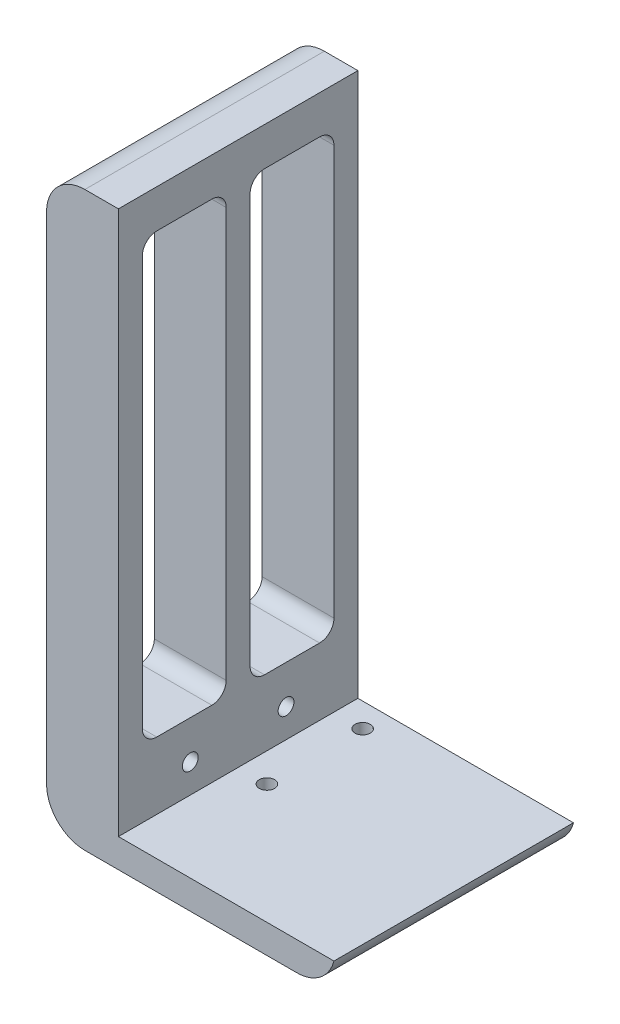
ISO-10303-21;
HEADER;
FILE_DESCRIPTION(('STEP AP214'),'2;1');
FILE_NAME('part.step','',(''),(''),'','','');
FILE_SCHEMA(('AUTOMOTIVE_DESIGN { 1 0 10303 214 1 1 1 1 }'));
ENDSEC;
DATA;
#1=APPLICATION_CONTEXT('core data for automotive mechanical design processes');
#2=APPLICATION_PROTOCOL_DEFINITION('international standard','automotive_design',2000,#1);
#3=PRODUCT_CONTEXT('',#1,'mechanical');
#4=PRODUCT('Part','Part','',(#3));
#5=PRODUCT_RELATED_PRODUCT_CATEGORY('part','',(#4));
#6=PRODUCT_DEFINITION_FORMATION('','',#4);
#7=PRODUCT_DEFINITION_CONTEXT('part definition',#1,'design');
#8=PRODUCT_DEFINITION('design','',#6,#7);
#9=PRODUCT_DEFINITION_SHAPE('','',#8);
#10=(LENGTH_UNIT() NAMED_UNIT(*) SI_UNIT(.MILLI.,.METRE.));
#11=(NAMED_UNIT(*) PLANE_ANGLE_UNIT() SI_UNIT($,.RADIAN.));
#12=(NAMED_UNIT(*) SI_UNIT($,.STERADIAN.) SOLID_ANGLE_UNIT());
#13=UNCERTAINTY_MEASURE_WITH_UNIT(LENGTH_MEASURE(1.E-05),#10,'distance_accuracy_value','');
#14=(GEOMETRIC_REPRESENTATION_CONTEXT(3) GLOBAL_UNCERTAINTY_ASSIGNED_CONTEXT((#13)) GLOBAL_UNIT_ASSIGNED_CONTEXT((#10,
#11,#12)) REPRESENTATION_CONTEXT('',''));
#15=CARTESIAN_POINT('',(0.,0.,0.));
#16=DIRECTION('',(0.,0.,1.));
#17=DIRECTION('',(1.,0.,0.));
#18=AXIS2_PLACEMENT_3D('',#15,#16,#17);
#19=CARTESIAN_POINT('',(0.,0.,25.));
#20=DIRECTION('',(1.,0.,0.));
#21=DIRECTION('',(0.,0.,-1.));
#22=AXIS2_PLACEMENT_3D('',#19,#20,#21);
#23=PLANE('',#22);
#24=CARTESIAN_POINT('',(0.,12.,10.));
#25=DIRECTION('',(-1.,0.,0.));
#26=DIRECTION('',(0.,0.,1.));
#27=AXIS2_PLACEMENT_3D('',#24,#25,#26);
#28=CIRCLE('',#27,1.65);
#29=CARTESIAN_POINT('',(0.,12.,11.65));
#30=VERTEX_POINT('',#29);
#31=EDGE_CURVE('E269',#30,#30,#28,.T.);
#32=ORIENTED_EDGE('',*,*,#31,.F.);
#33=EDGE_LOOP('',(#32));
#34=FACE_BOUND('',#33,.T.);
#35=CARTESIAN_POINT('',(0.,12.,-10.));
#36=DIRECTION('',(-1.,0.,0.));
#37=DIRECTION('',(0.,0.,1.));
#38=AXIS2_PLACEMENT_3D('',#35,#36,#37);
#39=CIRCLE('',#38,1.65);
#40=CARTESIAN_POINT('',(0.,12.,-8.35));
#41=VERTEX_POINT('',#40);
#42=EDGE_CURVE('E259',#41,#41,#39,.T.);
#43=ORIENTED_EDGE('',*,*,#42,.F.);
#44=EDGE_LOOP('',(#43));
#45=FACE_BOUND('',#44,.T.);
#46=DIRECTION('',(0.,-1.,0.));
#47=VECTOR('',#46,1.);
#48=CARTESIAN_POINT('',(0.,20.,2.5));
#49=LINE('',#48,#47);
#50=CARTESIAN_POINT('',(0.,108.5,2.5));
#51=VERTEX_POINT('',#50);
#52=CARTESIAN_POINT('',(0.,23.,2.5));
#53=VERTEX_POINT('',#52);
#54=EDGE_CURVE('E237',#51,#53,#49,.T.);
#55=ORIENTED_EDGE('',*,*,#54,.F.);
#56=CARTESIAN_POINT('',(0.,108.5,5.5));
#57=DIRECTION('',(1.,0.,0.));
#58=DIRECTION('',(0.,0.,-1.));
#59=AXIS2_PLACEMENT_3D('',#56,#57,#58);
#60=CIRCLE('',#59,3.);
#61=CARTESIAN_POINT('',(0.,111.5,5.50000000000001));
#62=VERTEX_POINT('',#61);
#63=EDGE_CURVE('E189',#51,#62,#60,.T.);
#64=ORIENTED_EDGE('',*,*,#63,.T.);
#65=DIRECTION('',(0.,0.,-1.));
#66=VECTOR('',#65,1.);
#67=CARTESIAN_POINT('',(0.,111.5,25.));
#68=LINE('',#67,#66);
#69=CARTESIAN_POINT('',(0.,111.5,-5.5));
#70=VERTEX_POINT('',#69);
#71=EDGE_CURVE('E57',#62,#70,#68,.T.);
#72=ORIENTED_EDGE('',*,*,#71,.T.);
#73=CARTESIAN_POINT('',(0.,108.5,-5.5));
#74=DIRECTION('',(1.,0.,0.));
#75=DIRECTION('',(0.,0.,-1.));
#76=AXIS2_PLACEMENT_3D('',#73,#74,#75);
#77=CIRCLE('',#76,3.);
#78=CARTESIAN_POINT('',(0.,108.5,-2.5));
#79=VERTEX_POINT('',#78);
#80=EDGE_CURVE('E173',#70,#79,#77,.T.);
#81=ORIENTED_EDGE('',*,*,#80,.T.);
#82=DIRECTION('',(0.,1.,0.));
#83=VECTOR('',#82,1.);
#84=CARTESIAN_POINT('',(0.,20.,-2.5));
#85=LINE('',#84,#83);
#86=CARTESIAN_POINT('',(0.,23.,-2.5));
#87=VERTEX_POINT('',#86);
#88=EDGE_CURVE('E245',#87,#79,#85,.T.);
#89=ORIENTED_EDGE('',*,*,#88,.F.);
#90=CARTESIAN_POINT('',(0.,23.,-5.5));
#91=DIRECTION('',(1.,0.,0.));
#92=DIRECTION('',(0.,0.,-1.));
#93=AXIS2_PLACEMENT_3D('',#90,#91,#92);
#94=CIRCLE('',#93,3.);
#95=CARTESIAN_POINT('',(0.,20.,-5.5));
#96=VERTEX_POINT('',#95);
#97=EDGE_CURVE('E163',#87,#96,#94,.T.);
#98=ORIENTED_EDGE('',*,*,#97,.T.);
#99=DIRECTION('',(0.,0.,1.));
#100=VECTOR('',#99,1.);
#101=CARTESIAN_POINT('',(0.,20.,-20.));
#102=LINE('',#101,#100);
#103=CARTESIAN_POINT('',(0.,20.,-17.));
#104=VERTEX_POINT('',#103);
#105=EDGE_CURVE('E207',#104,#96,#102,.T.);
#106=ORIENTED_EDGE('',*,*,#105,.F.);
#107=CARTESIAN_POINT('',(0.,23.,-17.));
#108=DIRECTION('',(1.,0.,0.));
#109=DIRECTION('',(0.,0.,-1.));
#110=AXIS2_PLACEMENT_3D('',#107,#108,#109);
#111=CIRCLE('',#110,3.);
#112=CARTESIAN_POINT('',(0.,23.,-20.));
#113=VERTEX_POINT('',#112);
#114=EDGE_CURVE('E47',#104,#113,#111,.T.);
#115=ORIENTED_EDGE('',*,*,#114,.T.);
#116=DIRECTION('',(0.,-1.,0.));
#117=VECTOR('',#116,1.);
#118=CARTESIAN_POINT('',(0.,111.5,-20.));
#119=LINE('',#118,#117);
#120=CARTESIAN_POINT('',(0.,108.5,-20.));
#121=VERTEX_POINT('',#120);
#122=EDGE_CURVE('E201',#121,#113,#119,.T.);
#123=ORIENTED_EDGE('',*,*,#122,.F.);
#124=CARTESIAN_POINT('',(0.,108.5,-17.));
#125=DIRECTION('',(1.,0.,0.));
#126=DIRECTION('',(0.,0.,-1.));
#127=AXIS2_PLACEMENT_3D('',#124,#125,#126);
#128=CIRCLE('',#127,3.);
#129=CARTESIAN_POINT('',(0.,111.5,-17.));
#130=VERTEX_POINT('',#129);
#131=EDGE_CURVE('E177',#121,#130,#128,.T.);
#132=ORIENTED_EDGE('',*,*,#131,.T.);
#133=CARTESIAN_POINT('',(0.,111.5,-25.));
#134=VERTEX_POINT('',#133);
#135=EDGE_CURVE('E62',#130,#134,#68,.T.);
#136=ORIENTED_EDGE('',*,*,#135,.T.);
#137=DIRECTION('',(0.,-1.,0.));
#138=VECTOR('',#137,1.);
#139=CARTESIAN_POINT('',(0.,0.,-25.));
#140=LINE('',#139,#138);
#141=CARTESIAN_POINT('',(0.,8.,-25.));
#142=VERTEX_POINT('',#141);
#143=EDGE_CURVE('E284',#134,#142,#140,.T.);
#144=ORIENTED_EDGE('',*,*,#143,.T.);
#145=DIRECTION('',(0.,0.,-1.));
#146=VECTOR('',#145,1.);
#147=CARTESIAN_POINT('',(0.,8.,25.));
#148=LINE('',#147,#146);
#149=CARTESIAN_POINT('',(0.,8.,25.));
#150=VERTEX_POINT('',#149);
#151=EDGE_CURVE('E316',#142,#150,#148,.F.);
#152=ORIENTED_EDGE('',*,*,#151,.T.);
#153=DIRECTION('',(0.,-1.,0.));
#154=VECTOR('',#153,1.);
#155=CARTESIAN_POINT('',(0.,0.,25.));
#156=LINE('',#155,#154);
#157=CARTESIAN_POINT('',(0.,111.5,25.));
#158=VERTEX_POINT('',#157);
#159=EDGE_CURVE('E295',#158,#150,#156,.T.);
#160=ORIENTED_EDGE('',*,*,#159,.F.);
#161=CARTESIAN_POINT('',(0.,111.5,17.));
#162=VERTEX_POINT('',#161);
#163=EDGE_CURVE('E76',#158,#162,#68,.T.);
#164=ORIENTED_EDGE('',*,*,#163,.T.);
#165=CARTESIAN_POINT('',(0.,108.5,17.));
#166=DIRECTION('',(1.,0.,0.));
#167=DIRECTION('',(0.,0.,-1.));
#168=AXIS2_PLACEMENT_3D('',#165,#166,#167);
#169=CIRCLE('',#168,3.);
#170=CARTESIAN_POINT('',(0.,108.5,20.));
#171=VERTEX_POINT('',#170);
#172=EDGE_CURVE('E183',#162,#171,#169,.T.);
#173=ORIENTED_EDGE('',*,*,#172,.T.);
#174=DIRECTION('',(0.,1.,0.));
#175=VECTOR('',#174,1.);
#176=CARTESIAN_POINT('',(0.,111.5,20.));
#177=LINE('',#176,#175);
#178=CARTESIAN_POINT('',(0.,23.,20.));
#179=VERTEX_POINT('',#178);
#180=EDGE_CURVE('E242',#179,#171,#177,.T.);
#181=ORIENTED_EDGE('',*,*,#180,.F.);
#182=CARTESIAN_POINT('',(0.,23.,17.));
#183=DIRECTION('',(1.,0.,0.));
#184=DIRECTION('',(0.,0.,-1.));
#185=AXIS2_PLACEMENT_3D('',#182,#183,#184);
#186=CIRCLE('',#185,3.);
#187=CARTESIAN_POINT('',(0.,20.,17.));
#188=VERTEX_POINT('',#187);
#189=EDGE_CURVE('E192',#179,#188,#186,.T.);
#190=ORIENTED_EDGE('',*,*,#189,.T.);
#191=DIRECTION('',(0.,0.,1.));
#192=VECTOR('',#191,1.);
#193=CARTESIAN_POINT('',(0.,20.,20.));
#194=LINE('',#193,#192);
#195=CARTESIAN_POINT('',(0.,20.,5.49999999999999));
#196=VERTEX_POINT('',#195);
#197=EDGE_CURVE('E239',#196,#188,#194,.T.);
#198=ORIENTED_EDGE('',*,*,#197,.F.);
#199=CARTESIAN_POINT('',(0.,23.,5.5));
#200=DIRECTION('',(1.,0.,0.));
#201=DIRECTION('',(0.,0.,-1.));
#202=AXIS2_PLACEMENT_3D('',#199,#200,#201);
#203=CIRCLE('',#202,3.);
#204=EDGE_CURVE('E143',#196,#53,#203,.T.);
#205=ORIENTED_EDGE('',*,*,#204,.T.);
#206=EDGE_LOOP('',(#55,#64,#72,#81,#89,#98,#106,#115,#123,#132,#136,#144,#152,#160,#164,#173,
#181,#190,#198,#205));
#207=FACE_BOUND('',#206,.T.);
#208=ADVANCED_FACE('F41',(#34,#45,#207),#23,.F.);
#209=CARTESIAN_POINT('',(60.,0.,25.));
#210=DIRECTION('',(0.,1.,0.));
#211=DIRECTION('',(-1.,0.,0.));
#212=AXIS2_PLACEMENT_3D('',#209,#210,#211);
#213=PLANE('',#212);
#214=CARTESIAN_POINT('',(21.0000000000001,0.,0.));
#215=DIRECTION('',(0.,1.,0.));
#216=DIRECTION('',(0.,0.,1.));
#217=AXIS2_PLACEMENT_3D('',#214,#215,#216);
#218=CIRCLE('',#217,1.6);
#219=CARTESIAN_POINT('',(21.0000000000001,0.,1.59999999999995));
#220=VERTEX_POINT('',#219);
#221=EDGE_CURVE('E260',#220,#220,#218,.T.);
#222=ORIENTED_EDGE('',*,*,#221,.T.);
#223=EDGE_LOOP('',(#222));
#224=FACE_BOUND('',#223,.T.);
#225=CARTESIAN_POINT('',(21.0000000000001,0.,-20.0000000000001));
#226=DIRECTION('',(0.,1.,0.));
#227=DIRECTION('',(0.,0.,1.));
#228=AXIS2_PLACEMENT_3D('',#225,#226,#227);
#229=CIRCLE('',#228,1.6);
#230=CARTESIAN_POINT('',(21.0000000000001,0.,-18.4000000000001));
#231=VERTEX_POINT('',#230);
#232=EDGE_CURVE('E256',#231,#231,#229,.T.);
#233=ORIENTED_EDGE('',*,*,#232,.T.);
#234=EDGE_LOOP('',(#233));
#235=FACE_BOUND('',#234,.T.);
#236=DIRECTION('',(1.,0.,0.));
#237=VECTOR('',#236,1.);
#238=CARTESIAN_POINT('',(60.,0.,-25.));
#239=LINE('',#238,#237);
#240=CARTESIAN_POINT('',(8.,0.,-25.));
#241=VERTEX_POINT('',#240);
#242=CARTESIAN_POINT('',(52.2540333075852,0.,-25.));
#243=VERTEX_POINT('',#242);
#244=EDGE_CURVE('E279',#241,#243,#239,.T.);
#245=ORIENTED_EDGE('',*,*,#244,.T.);
#246=DIRECTION('',(0.,0.,1.));
#247=VECTOR('',#246,1.);
#248=CARTESIAN_POINT('',(52.2540333075852,0.,25.));
#249=LINE('',#248,#247);
#250=CARTESIAN_POINT('',(52.2540333075852,0.,25.));
#251=VERTEX_POINT('',#250);
#252=EDGE_CURVE('E350',#243,#251,#249,.T.);
#253=ORIENTED_EDGE('',*,*,#252,.T.);
#254=DIRECTION('',(1.,0.,0.));
#255=VECTOR('',#254,1.);
#256=CARTESIAN_POINT('',(60.,0.,25.));
#257=LINE('',#256,#255);
#258=CARTESIAN_POINT('',(8.,0.,25.));
#259=VERTEX_POINT('',#258);
#260=EDGE_CURVE('E281',#259,#251,#257,.T.);
#261=ORIENTED_EDGE('',*,*,#260,.F.);
#262=DIRECTION('',(0.,0.,-1.));
#263=VECTOR('',#262,1.);
#264=CARTESIAN_POINT('',(8.,0.,25.));
#265=LINE('',#264,#263);
#266=EDGE_CURVE('E343',#259,#241,#265,.T.);
#267=ORIENTED_EDGE('',*,*,#266,.T.);
#268=EDGE_LOOP('',(#245,#253,#261,#267));
#269=FACE_BOUND('',#268,.T.);
#270=ADVANCED_FACE('F409',(#224,#235,#269),#213,.F.);
#271=CARTESIAN_POINT('',(15.,6.,25.));
#272=DIRECTION('',(0.,-1.,0.));
#273=DIRECTION('',(0.,0.,-1.));
#274=AXIS2_PLACEMENT_3D('',#271,#272,#273);
#275=PLANE('',#274);
#276=CARTESIAN_POINT('',(21.0000000000001,6.,0.));
#277=DIRECTION('',(0.,1.,0.));
#278=DIRECTION('',(0.,0.,1.));
#279=AXIS2_PLACEMENT_3D('',#276,#277,#278);
#280=CIRCLE('',#279,1.6);
#281=CARTESIAN_POINT('',(21.0000000000001,6.,1.59999999999995));
#282=VERTEX_POINT('',#281);
#283=EDGE_CURVE('E261',#282,#282,#280,.T.);
#284=ORIENTED_EDGE('',*,*,#283,.F.);
#285=EDGE_LOOP('',(#284));
#286=FACE_BOUND('',#285,.T.);
#287=CARTESIAN_POINT('',(21.0000000000001,6.,-20.0000000000001));
#288=DIRECTION('',(0.,1.,0.));
#289=DIRECTION('',(0.,0.,1.));
#290=AXIS2_PLACEMENT_3D('',#287,#288,#289);
#291=CIRCLE('',#290,1.6);
#292=CARTESIAN_POINT('',(21.0000000000001,6.,-18.4000000000001));
#293=VERTEX_POINT('',#292);
#294=EDGE_CURVE('E262',#293,#293,#291,.T.);
#295=ORIENTED_EDGE('',*,*,#294,.F.);
#296=EDGE_LOOP('',(#295));
#297=FACE_BOUND('',#296,.T.);
#298=DIRECTION('',(-1.,0.,0.));
#299=VECTOR('',#298,1.);
#300=CARTESIAN_POINT('',(15.,6.,-25.));
#301=LINE('',#300,#299);
#302=CARTESIAN_POINT('',(60.,6.,-25.));
#303=VERTEX_POINT('',#302);
#304=CARTESIAN_POINT('',(15.,6.,-25.));
#305=VERTEX_POINT('',#304);
#306=EDGE_CURVE('E297',#303,#305,#301,.T.);
#307=ORIENTED_EDGE('',*,*,#306,.T.);
#308=DIRECTION('',(0.,0.,-1.));
#309=VECTOR('',#308,1.);
#310=CARTESIAN_POINT('',(15.,6.,25.));
#311=LINE('',#310,#309);
#312=CARTESIAN_POINT('',(15.,6.,25.));
#313=VERTEX_POINT('',#312);
#314=EDGE_CURVE('E312',#313,#305,#311,.T.);
#315=ORIENTED_EDGE('',*,*,#314,.F.);
#316=DIRECTION('',(-1.,0.,0.));
#317=VECTOR('',#316,1.);
#318=CARTESIAN_POINT('',(15.,6.,25.));
#319=LINE('',#318,#317);
#320=CARTESIAN_POINT('',(60.,6.,25.));
#321=VERTEX_POINT('',#320);
#322=EDGE_CURVE('E282',#321,#313,#319,.T.);
#323=ORIENTED_EDGE('',*,*,#322,.F.);
#324=DIRECTION('',(0.,0.,-1.));
#325=VECTOR('',#324,1.);
#326=CARTESIAN_POINT('',(60.,6.,25.));
#327=LINE('',#326,#325);
#328=EDGE_CURVE('E317',#321,#303,#327,.T.);
#329=ORIENTED_EDGE('',*,*,#328,.T.);
#330=EDGE_LOOP('',(#307,#315,#323,#329));
#331=FACE_BOUND('',#330,.T.);
#332=ADVANCED_FACE('F435',(#286,#297,#331),#275,.F.);
#333=CARTESIAN_POINT('',(15.,119.5,25.));
#334=DIRECTION('',(-1.,0.,0.));
#335=DIRECTION('',(0.,-1.,0.));
#336=AXIS2_PLACEMENT_3D('',#333,#334,#335);
#337=PLANE('',#336);
#338=DIRECTION('',(0.,0.,-1.));
#339=VECTOR('',#338,1.);
#340=CARTESIAN_POINT('',(15.,111.5,25.));
#341=LINE('',#340,#339);
#342=CARTESIAN_POINT('',(15.,111.5,-5.5));
#343=VERTEX_POINT('',#342);
#344=CARTESIAN_POINT('',(15.,111.5,-17.));
#345=VERTEX_POINT('',#344);
#346=EDGE_CURVE('E351',#343,#345,#341,.T.);
#347=ORIENTED_EDGE('',*,*,#346,.T.);
#348=CARTESIAN_POINT('',(15.,108.5,-17.));
#349=DIRECTION('',(-1.,0.,0.));
#350=DIRECTION('',(0.,-1.,0.));
#351=AXIS2_PLACEMENT_3D('',#348,#349,#350);
#352=CIRCLE('',#351,3.);
#353=CARTESIAN_POINT('',(15.,108.5,-20.));
#354=VERTEX_POINT('',#353);
#355=EDGE_CURVE('E185',#345,#354,#352,.T.);
#356=ORIENTED_EDGE('',*,*,#355,.T.);
#357=DIRECTION('',(0.,-1.,0.));
#358=VECTOR('',#357,1.);
#359=CARTESIAN_POINT('',(15.,119.5,-20.));
#360=LINE('',#359,#358);
#361=CARTESIAN_POINT('',(15.,23.,-20.));
#362=VERTEX_POINT('',#361);
#363=EDGE_CURVE('E158',#354,#362,#360,.T.);
#364=ORIENTED_EDGE('',*,*,#363,.T.);
#365=CARTESIAN_POINT('',(15.,23.,-17.));
#366=DIRECTION('',(-1.,0.,0.));
#367=DIRECTION('',(0.,-1.,0.));
#368=AXIS2_PLACEMENT_3D('',#365,#366,#367);
#369=CIRCLE('',#368,3.);
#370=CARTESIAN_POINT('',(15.,20.,-17.));
#371=VERTEX_POINT('',#370);
#372=EDGE_CURVE('E11',#362,#371,#369,.T.);
#373=ORIENTED_EDGE('',*,*,#372,.T.);
#374=DIRECTION('',(0.,0.,1.));
#375=VECTOR('',#374,1.);
#376=CARTESIAN_POINT('',(15.,20.,25.));
#377=LINE('',#376,#375);
#378=CARTESIAN_POINT('',(15.,20.,-5.5));
#379=VERTEX_POINT('',#378);
#380=EDGE_CURVE('E154',#371,#379,#377,.T.);
#381=ORIENTED_EDGE('',*,*,#380,.T.);
#382=CARTESIAN_POINT('',(15.,23.,-5.5));
#383=DIRECTION('',(-1.,0.,0.));
#384=DIRECTION('',(0.,-1.,0.));
#385=AXIS2_PLACEMENT_3D('',#382,#383,#384);
#386=CIRCLE('',#385,3.);
#387=CARTESIAN_POINT('',(15.,23.,-2.5));
#388=VERTEX_POINT('',#387);
#389=EDGE_CURVE('E167',#379,#388,#386,.T.);
#390=ORIENTED_EDGE('',*,*,#389,.T.);
#391=DIRECTION('',(0.,1.,0.));
#392=VECTOR('',#391,1.);
#393=CARTESIAN_POINT('',(15.,119.5,-2.5));
#394=LINE('',#393,#392);
#395=CARTESIAN_POINT('',(15.,108.5,-2.5));
#396=VERTEX_POINT('',#395);
#397=EDGE_CURVE('E249',#388,#396,#394,.T.);
#398=ORIENTED_EDGE('',*,*,#397,.T.);
#399=CARTESIAN_POINT('',(15.,108.5,-5.5));
#400=DIRECTION('',(-1.,0.,0.));
#401=DIRECTION('',(0.,-1.,0.));
#402=AXIS2_PLACEMENT_3D('',#399,#400,#401);
#403=CIRCLE('',#402,3.);
#404=EDGE_CURVE('E176',#396,#343,#403,.T.);
#405=ORIENTED_EDGE('',*,*,#404,.T.);
#406=EDGE_LOOP('',(#347,#356,#364,#373,#381,#390,#398,#405));
#407=FACE_BOUND('',#406,.T.);
#408=DIRECTION('',(0.,1.,0.));
#409=VECTOR('',#408,1.);
#410=CARTESIAN_POINT('',(15.,119.5,20.));
#411=LINE('',#410,#409);
#412=CARTESIAN_POINT('',(15.,23.,20.));
#413=VERTEX_POINT('',#412);
#414=CARTESIAN_POINT('',(15.,108.5,20.));
#415=VERTEX_POINT('',#414);
#416=EDGE_CURVE('E213',#413,#415,#411,.T.);
#417=ORIENTED_EDGE('',*,*,#416,.T.);
#418=CARTESIAN_POINT('',(15.,108.5,17.));
#419=DIRECTION('',(-1.,0.,0.));
#420=DIRECTION('',(0.,-1.,0.));
#421=AXIS2_PLACEMENT_3D('',#418,#419,#420);
#422=CIRCLE('',#421,3.);
#423=CARTESIAN_POINT('',(15.,111.5,17.));
#424=VERTEX_POINT('',#423);
#425=EDGE_CURVE('E187',#415,#424,#422,.T.);
#426=ORIENTED_EDGE('',*,*,#425,.T.);
#427=DIRECTION('',(0.,0.,-1.));
#428=VECTOR('',#427,1.);
#429=CARTESIAN_POINT('',(15.,111.5,25.));
#430=LINE('',#429,#428);
#431=CARTESIAN_POINT('',(15.,111.5,5.50000000000001));
#432=VERTEX_POINT('',#431);
#433=EDGE_CURVE('E349',#424,#432,#430,.T.);
#434=ORIENTED_EDGE('',*,*,#433,.T.);
#435=CARTESIAN_POINT('',(15.,108.5,5.5));
#436=DIRECTION('',(-1.,0.,0.));
#437=DIRECTION('',(0.,-1.,0.));
#438=AXIS2_PLACEMENT_3D('',#435,#436,#437);
#439=CIRCLE('',#438,3.);
#440=CARTESIAN_POINT('',(15.,108.5,2.5));
#441=VERTEX_POINT('',#440);
#442=EDGE_CURVE('E191',#432,#441,#439,.T.);
#443=ORIENTED_EDGE('',*,*,#442,.T.);
#444=DIRECTION('',(0.,-1.,0.));
#445=VECTOR('',#444,1.);
#446=CARTESIAN_POINT('',(15.,119.5,2.5));
#447=LINE('',#446,#445);
#448=CARTESIAN_POINT('',(15.,23.,2.5));
#449=VERTEX_POINT('',#448);
#450=EDGE_CURVE('E142',#441,#449,#447,.T.);
#451=ORIENTED_EDGE('',*,*,#450,.T.);
#452=CARTESIAN_POINT('',(15.,23.,5.5));
#453=DIRECTION('',(-1.,0.,0.));
#454=DIRECTION('',(0.,-1.,0.));
#455=AXIS2_PLACEMENT_3D('',#452,#453,#454);
#456=CIRCLE('',#455,3.);
#457=CARTESIAN_POINT('',(15.,20.,5.49999999999999));
#458=VERTEX_POINT('',#457);
#459=EDGE_CURVE('E133',#449,#458,#456,.T.);
#460=ORIENTED_EDGE('',*,*,#459,.T.);
#461=DIRECTION('',(0.,0.,1.));
#462=VECTOR('',#461,1.);
#463=CARTESIAN_POINT('',(15.,20.,24.9999999999999));
#464=LINE('',#463,#462);
#465=CARTESIAN_POINT('',(15.,20.,17.));
#466=VERTEX_POINT('',#465);
#467=EDGE_CURVE('E136',#458,#466,#464,.T.);
#468=ORIENTED_EDGE('',*,*,#467,.T.);
#469=CARTESIAN_POINT('',(15.,23.,17.));
#470=DIRECTION('',(-1.,0.,0.));
#471=DIRECTION('',(0.,-1.,0.));
#472=AXIS2_PLACEMENT_3D('',#469,#470,#471);
#473=CIRCLE('',#472,3.);
#474=EDGE_CURVE('E194',#466,#413,#473,.T.);
#475=ORIENTED_EDGE('',*,*,#474,.T.);
#476=EDGE_LOOP('',(#417,#426,#434,#443,#451,#460,#468,#475));
#477=FACE_BOUND('',#476,.T.);
#478=CARTESIAN_POINT('',(15.,12.,10.));
#479=DIRECTION('',(-1.,0.,0.));
#480=DIRECTION('',(0.,-1.,0.));
#481=AXIS2_PLACEMENT_3D('',#478,#479,#480);
#482=CIRCLE('',#481,1.65);
#483=CARTESIAN_POINT('',(15.,12.,11.65));
#484=VERTEX_POINT('',#483);
#485=EDGE_CURVE('E280',#484,#484,#482,.T.);
#486=ORIENTED_EDGE('',*,*,#485,.T.);
#487=EDGE_LOOP('',(#486));
#488=FACE_BOUND('',#487,.T.);
#489=CARTESIAN_POINT('',(15.,12.,-10.));
#490=DIRECTION('',(-1.,0.,0.));
#491=DIRECTION('',(0.,-1.,0.));
#492=AXIS2_PLACEMENT_3D('',#489,#490,#491);
#493=CIRCLE('',#492,1.65);
#494=CARTESIAN_POINT('',(15.,12.,-8.35));
#495=VERTEX_POINT('',#494);
#496=EDGE_CURVE('E275',#495,#495,#493,.T.);
#497=ORIENTED_EDGE('',*,*,#496,.T.);
#498=EDGE_LOOP('',(#497));
#499=FACE_BOUND('',#498,.T.);
#500=DIRECTION('',(0.,1.,0.));
#501=VECTOR('',#500,1.);
#502=CARTESIAN_POINT('',(15.,119.5,-25.));
#503=LINE('',#502,#501);
#504=CARTESIAN_POINT('',(15.,119.5,-25.));
#505=VERTEX_POINT('',#504);
#506=EDGE_CURVE('E303',#305,#505,#503,.T.);
#507=ORIENTED_EDGE('',*,*,#506,.T.);
#508=DIRECTION('',(0.,0.,-1.));
#509=VECTOR('',#508,1.);
#510=CARTESIAN_POINT('',(15.,119.5,25.));
#511=LINE('',#510,#509);
#512=CARTESIAN_POINT('',(15.,119.5,25.));
#513=VERTEX_POINT('',#512);
#514=EDGE_CURVE('E300',#513,#505,#511,.T.);
#515=ORIENTED_EDGE('',*,*,#514,.F.);
#516=DIRECTION('',(0.,1.,0.));
#517=VECTOR('',#516,1.);
#518=CARTESIAN_POINT('',(15.,119.5,25.));
#519=LINE('',#518,#517);
#520=EDGE_CURVE('E286',#313,#513,#519,.T.);
#521=ORIENTED_EDGE('',*,*,#520,.F.);
#522=ORIENTED_EDGE('',*,*,#314,.T.);
#523=EDGE_LOOP('',(#507,#515,#521,#522));
#524=FACE_BOUND('',#523,.T.);
#525=ADVANCED_FACE('F138',(#407,#477,#488,#499,#524),#337,.F.);
#526=CARTESIAN_POINT('',(0.,119.5,25.));
#527=DIRECTION('',(0.,-1.,0.));
#528=DIRECTION('',(0.,0.,-1.));
#529=AXIS2_PLACEMENT_3D('',#526,#527,#528);
#530=PLANE('',#529);
#531=DIRECTION('',(-1.,0.,0.));
#532=VECTOR('',#531,1.);
#533=CARTESIAN_POINT('',(0.,119.5,-25.));
#534=LINE('',#533,#532);
#535=CARTESIAN_POINT('',(8.,119.5,-25.));
#536=VERTEX_POINT('',#535);
#537=EDGE_CURVE('E306',#505,#536,#534,.T.);
#538=ORIENTED_EDGE('',*,*,#537,.T.);
#539=DIRECTION('',(0.,0.,-1.));
#540=VECTOR('',#539,1.);
#541=CARTESIAN_POINT('',(8.,119.5,25.));
#542=LINE('',#541,#540);
#543=CARTESIAN_POINT('',(8.,119.5,25.));
#544=VERTEX_POINT('',#543);
#545=EDGE_CURVE('E335',#536,#544,#542,.F.);
#546=ORIENTED_EDGE('',*,*,#545,.T.);
#547=DIRECTION('',(-1.,0.,0.));
#548=VECTOR('',#547,1.);
#549=CARTESIAN_POINT('',(0.,119.5,25.));
#550=LINE('',#549,#548);
#551=EDGE_CURVE('E293',#513,#544,#550,.T.);
#552=ORIENTED_EDGE('',*,*,#551,.F.);
#553=ORIENTED_EDGE('',*,*,#514,.T.);
#554=EDGE_LOOP('',(#538,#546,#552,#553));
#555=FACE_BOUND('',#554,.T.);
#556=ADVANCED_FACE('F443',(#555),#530,.F.);
#557=CARTESIAN_POINT('',(0.,0.,25.));
#558=DIRECTION('',(0.,0.,-1.));
#559=DIRECTION('',(-1.,0.,0.));
#560=AXIS2_PLACEMENT_3D('',#557,#558,#559);
#561=PLANE('',#560);
#562=ORIENTED_EDGE('',*,*,#551,.T.);
#563=CARTESIAN_POINT('',(8.,111.5,25.));
#564=DIRECTION('',(0.,0.,-1.));
#565=DIRECTION('',(-1.,0.,0.));
#566=AXIS2_PLACEMENT_3D('',#563,#564,#565);
#567=CIRCLE('',#566,8.);
#568=EDGE_CURVE('E341',#544,#158,#567,.F.);
#569=ORIENTED_EDGE('',*,*,#568,.T.);
#570=ORIENTED_EDGE('',*,*,#159,.T.);
#571=CARTESIAN_POINT('',(8.,8.,25.));
#572=DIRECTION('',(0.,0.,-1.));
#573=DIRECTION('',(-1.,0.,0.));
#574=AXIS2_PLACEMENT_3D('',#571,#572,#573);
#575=CIRCLE('',#574,8.);
#576=EDGE_CURVE('E332',#150,#259,#575,.F.);
#577=ORIENTED_EDGE('',*,*,#576,.T.);
#578=ORIENTED_EDGE('',*,*,#260,.T.);
#579=CARTESIAN_POINT('',(52.2540333075852,8.,25.));
#580=DIRECTION('',(0.,0.,-1.));
#581=DIRECTION('',(-1.,0.,0.));
#582=AXIS2_PLACEMENT_3D('',#579,#580,#581);
#583=CIRCLE('',#582,8.);
#584=EDGE_CURVE('E336',#251,#321,#583,.F.);
#585=ORIENTED_EDGE('',*,*,#584,.T.);
#586=ORIENTED_EDGE('',*,*,#322,.T.);
#587=ORIENTED_EDGE('',*,*,#520,.T.);
#588=EDGE_LOOP('',(#562,#569,#570,#577,#578,#585,#586,#587));
#589=FACE_BOUND('',#588,.T.);
#590=ADVANCED_FACE('F420',(#589),#561,.F.);
#591=CARTESIAN_POINT('',(0.,0.,-25.));
#592=DIRECTION('',(0.,0.,-1.));
#593=DIRECTION('',(-1.,0.,0.));
#594=AXIS2_PLACEMENT_3D('',#591,#592,#593);
#595=PLANE('',#594);
#596=ORIENTED_EDGE('',*,*,#143,.F.);
#597=CARTESIAN_POINT('',(8.,111.5,-25.));
#598=DIRECTION('',(0.,0.,-1.));
#599=DIRECTION('',(-1.,0.,0.));
#600=AXIS2_PLACEMENT_3D('',#597,#598,#599);
#601=CIRCLE('',#600,8.);
#602=EDGE_CURVE('E327',#134,#536,#601,.T.);
#603=ORIENTED_EDGE('',*,*,#602,.T.);
#604=ORIENTED_EDGE('',*,*,#537,.F.);
#605=ORIENTED_EDGE('',*,*,#506,.F.);
#606=ORIENTED_EDGE('',*,*,#306,.F.);
#607=CARTESIAN_POINT('',(52.2540333075852,8.,-25.));
#608=DIRECTION('',(0.,0.,-1.));
#609=DIRECTION('',(-1.,0.,0.));
#610=AXIS2_PLACEMENT_3D('',#607,#608,#609);
#611=CIRCLE('',#610,8.);
#612=EDGE_CURVE('E326',#303,#243,#611,.T.);
#613=ORIENTED_EDGE('',*,*,#612,.T.);
#614=ORIENTED_EDGE('',*,*,#244,.F.);
#615=CARTESIAN_POINT('',(8.,8.,-25.));
#616=DIRECTION('',(0.,0.,-1.));
#617=DIRECTION('',(-1.,0.,0.));
#618=AXIS2_PLACEMENT_3D('',#615,#616,#617);
#619=CIRCLE('',#618,8.);
#620=EDGE_CURVE('E322',#241,#142,#619,.T.);
#621=ORIENTED_EDGE('',*,*,#620,.T.);
#622=EDGE_LOOP('',(#596,#603,#604,#605,#606,#613,#614,#621));
#623=FACE_BOUND('',#622,.T.);
#624=ADVANCED_FACE('F392',(#623),#595,.T.);
#625=CARTESIAN_POINT('',(8.,111.5,25.));
#626=DIRECTION('',(0.,0.,-1.));
#627=DIRECTION('',(-1.,0.,0.));
#628=AXIS2_PLACEMENT_3D('',#625,#626,#627);
#629=CYLINDRICAL_SURFACE('',#628,8.);
#630=ORIENTED_EDGE('',*,*,#568,.F.);
#631=ORIENTED_EDGE('',*,*,#545,.F.);
#632=ORIENTED_EDGE('',*,*,#602,.F.);
#633=ORIENTED_EDGE('',*,*,#135,.F.);
#634=DIRECTION('',(0.,0.,-1.));
#635=VECTOR('',#634,1.);
#636=CARTESIAN_POINT('',(0.,111.5,-2.5));
#637=LINE('',#636,#635);
#638=EDGE_CURVE('E214',#70,#130,#637,.T.);
#639=ORIENTED_EDGE('',*,*,#638,.F.);
#640=ORIENTED_EDGE('',*,*,#71,.F.);
#641=DIRECTION('',(0.,0.,-1.));
#642=VECTOR('',#641,1.);
#643=CARTESIAN_POINT('',(0.,111.5,2.5));
#644=LINE('',#643,#642);
#645=EDGE_CURVE('E450',#162,#62,#644,.T.);
#646=ORIENTED_EDGE('',*,*,#645,.F.);
#647=ORIENTED_EDGE('',*,*,#163,.F.);
#648=EDGE_LOOP('',(#630,#631,#632,#633,#639,#640,#646,#647));
#649=FACE_BOUND('',#648,.T.);
#650=ADVANCED_FACE('F389',(#649),#629,.T.);
#651=CARTESIAN_POINT('',(52.2540333075852,8.,25.));
#652=DIRECTION('',(0.,0.,1.));
#653=DIRECTION('',(1.,0.,0.));
#654=AXIS2_PLACEMENT_3D('',#651,#652,#653);
#655=CYLINDRICAL_SURFACE('',#654,8.);
#656=ORIENTED_EDGE('',*,*,#584,.F.);
#657=ORIENTED_EDGE('',*,*,#252,.F.);
#658=ORIENTED_EDGE('',*,*,#612,.F.);
#659=ORIENTED_EDGE('',*,*,#328,.F.);
#660=EDGE_LOOP('',(#656,#657,#658,#659));
#661=FACE_BOUND('',#660,.T.);
#662=ADVANCED_FACE('F425',(#661),#655,.T.);
#663=CARTESIAN_POINT('',(8.,8.,25.));
#664=DIRECTION('',(0.,0.,-1.));
#665=DIRECTION('',(-1.,0.,0.));
#666=AXIS2_PLACEMENT_3D('',#663,#664,#665);
#667=CYLINDRICAL_SURFACE('',#666,8.);
#668=ORIENTED_EDGE('',*,*,#576,.F.);
#669=ORIENTED_EDGE('',*,*,#151,.F.);
#670=ORIENTED_EDGE('',*,*,#620,.F.);
#671=ORIENTED_EDGE('',*,*,#266,.F.);
#672=EDGE_LOOP('',(#668,#669,#670,#671));
#673=FACE_BOUND('',#672,.T.);
#674=ADVANCED_FACE('F401',(#673),#667,.T.);
#675=CARTESIAN_POINT('',(60.,12.,-10.));
#676=DIRECTION('',(-1.,0.,0.));
#677=DIRECTION('',(0.,0.,1.));
#678=AXIS2_PLACEMENT_3D('',#675,#676,#677);
#679=CYLINDRICAL_SURFACE('',#678,1.65);
#680=CARTESIAN_POINT('',(0.,12.,-8.35));
#681=CARTESIAN_POINT('',(0.156250000000002,12.,-8.35));
#682=CARTESIAN_POINT('',(0.312500000000003,12.,-8.35));
#683=CARTESIAN_POINT('',(0.625000000000003,12.,-8.35));
#684=CARTESIAN_POINT('',(0.781250000000002,12.,-8.35));
#685=CARTESIAN_POINT('',(1.09375,12.,-8.35));
#686=CARTESIAN_POINT('',(1.25,12.,-8.35));
#687=CARTESIAN_POINT('',(1.5625,12.,-8.35));
#688=CARTESIAN_POINT('',(1.71875,12.,-8.35));
#689=CARTESIAN_POINT('',(2.03125,12.,-8.35));
#690=CARTESIAN_POINT('',(2.1875,12.,-8.35));
#691=CARTESIAN_POINT('',(2.5,12.,-8.35));
#692=CARTESIAN_POINT('',(2.65625,12.,-8.35));
#693=CARTESIAN_POINT('',(2.96875,12.,-8.35));
#694=CARTESIAN_POINT('',(3.125,12.,-8.35));
#695=CARTESIAN_POINT('',(3.4375,12.,-8.35));
#696=CARTESIAN_POINT('',(3.59375,12.,-8.35));
#697=CARTESIAN_POINT('',(3.90625,12.,-8.35));
#698=CARTESIAN_POINT('',(4.06250000000001,12.,-8.35));
#699=CARTESIAN_POINT('',(4.37500000000001,12.,-8.35));
#700=CARTESIAN_POINT('',(4.53125000000001,12.,-8.35));
#701=CARTESIAN_POINT('',(4.84375,12.,-8.35));
#702=CARTESIAN_POINT('',(5.,12.,-8.35));
#703=CARTESIAN_POINT('',(5.3125,12.,-8.35));
#704=CARTESIAN_POINT('',(5.46875,12.,-8.35));
#705=CARTESIAN_POINT('',(5.78125000000001,12.,-8.35));
#706=CARTESIAN_POINT('',(5.93750000000001,12.,-8.35));
#707=CARTESIAN_POINT('',(6.25000000000001,12.,-8.35));
#708=CARTESIAN_POINT('',(6.40625000000001,12.,-8.35));
#709=CARTESIAN_POINT('',(6.71875000000001,12.,-8.35));
#710=CARTESIAN_POINT('',(6.875,12.,-8.35));
#711=CARTESIAN_POINT('',(7.1875,12.,-8.35));
#712=CARTESIAN_POINT('',(7.34375000000001,12.,-8.35));
#713=CARTESIAN_POINT('',(7.65625000000001,12.,-8.35));
#714=CARTESIAN_POINT('',(7.81250000000001,12.,-8.35));
#715=CARTESIAN_POINT('',(8.12500000000001,12.,-8.35));
#716=CARTESIAN_POINT('',(8.28125000000001,12.,-8.35));
#717=CARTESIAN_POINT('',(8.59375000000001,12.,-8.35));
#718=CARTESIAN_POINT('',(8.75000000000001,12.,-8.35));
#719=CARTESIAN_POINT('',(9.06250000000001,12.,-8.35));
#720=CARTESIAN_POINT('',(9.21875000000001,12.,-8.35));
#721=CARTESIAN_POINT('',(9.53125000000001,12.,-8.35));
#722=CARTESIAN_POINT('',(9.68750000000001,12.,-8.35));
#723=CARTESIAN_POINT('',(10.,12.,-8.35));
#724=CARTESIAN_POINT('',(10.15625,12.,-8.35));
#725=CARTESIAN_POINT('',(10.46875,12.,-8.35));
#726=CARTESIAN_POINT('',(10.625,12.,-8.35));
#727=CARTESIAN_POINT('',(10.9375,12.,-8.35));
#728=CARTESIAN_POINT('',(11.09375,12.,-8.35));
#729=CARTESIAN_POINT('',(11.40625,12.,-8.35));
#730=CARTESIAN_POINT('',(11.5625,12.,-8.35));
#731=CARTESIAN_POINT('',(11.875,12.,-8.35));
#732=CARTESIAN_POINT('',(12.03125,12.,-8.35));
#733=CARTESIAN_POINT('',(12.34375,12.,-8.35));
#734=CARTESIAN_POINT('',(12.5,12.,-8.35));
#735=CARTESIAN_POINT('',(12.8125,12.,-8.35));
#736=CARTESIAN_POINT('',(12.96875,12.,-8.35));
#737=CARTESIAN_POINT('',(13.28125,12.,-8.35));
#738=CARTESIAN_POINT('',(13.4375,12.,-8.35));
#739=CARTESIAN_POINT('',(13.75,12.,-8.35));
#740=CARTESIAN_POINT('',(13.90625,12.,-8.35));
#741=CARTESIAN_POINT('',(14.21875,12.,-8.35));
#742=CARTESIAN_POINT('',(14.375,12.,-8.35));
#743=CARTESIAN_POINT('',(14.6875,12.,-8.35));
#744=CARTESIAN_POINT('',(14.84375,12.,-8.35));
#745=CARTESIAN_POINT('',(15.,12.,-8.35));
#746=B_SPLINE_CURVE_WITH_KNOTS('',3,(#680,#681,#682,#683,#684,#685,#686,#687,#688,#689,#690,
#691,#692,#693,#694,#695,#696,#697,#698,#699,#700,#701,#702,#703,#704,#705,#706,#707,#708,#709,
#710,#711,#712,#713,#714,#715,#716,#717,#718,#719,#720,#721,#722,#723,#724,#725,#726,#727,#728,
#729,#730,#731,#732,#733,#734,#735,#736,#737,#738,#739,#740,#741,#742,#743,#744,#745),
.UNSPECIFIED.,.F.,.F.,(4,2,2,2,2,2,2,2,2,2,2,2,2,2,2,2,2,2,2,2,2,2,2,2,2,2,2,2,2,2,2,2,4),(0.,
0.468750000000004,0.937500000000001,1.40625,1.875,2.34375000000001,2.8125,3.28125,3.75,
4.21875000000001,4.6875,5.15625,5.62500000000001,6.09375000000001,6.56250000000001,7.03125,
7.50000000000001,7.96875000000001,8.43750000000001,8.90625,9.37500000000001,9.84375000000001,
10.3125,10.78125,11.25,11.71875,12.1875,12.65625,13.125,13.59375,14.0625,14.53125,15.),.UNSPECIFIED.);
#747=EDGE_CURVE('BSEAM535',#41,#495,#746,.T.);
#748=ORIENTED_EDGE('',*,*,#42,.T.);
#749=ORIENTED_EDGE('',*,*,#496,.F.);
#750=ORIENTED_EDGE('',*,*,#747,.T.);
#751=ORIENTED_EDGE('',*,*,#747,.F.);
#752=EDGE_LOOP('',(#748,#750,#749,#751));
#753=FACE_BOUND('',#752,.T.);
#754=ADVANCED_FACE('F535',(#753),#679,.F.);
#755=CARTESIAN_POINT('',(60.,12.,10.));
#756=DIRECTION('',(-1.,0.,0.));
#757=DIRECTION('',(0.,0.,1.));
#758=AXIS2_PLACEMENT_3D('',#755,#756,#757);
#759=CYLINDRICAL_SURFACE('',#758,1.65);
#760=CARTESIAN_POINT('',(0.,12.,11.65));
#761=CARTESIAN_POINT('',(0.156250000000002,12.,11.65));
#762=CARTESIAN_POINT('',(0.312500000000003,12.,11.65));
#763=CARTESIAN_POINT('',(0.625000000000003,12.,11.65));
#764=CARTESIAN_POINT('',(0.781250000000002,12.,11.65));
#765=CARTESIAN_POINT('',(1.09375,12.,11.65));
#766=CARTESIAN_POINT('',(1.25,12.,11.65));
#767=CARTESIAN_POINT('',(1.5625,12.,11.65));
#768=CARTESIAN_POINT('',(1.71875,12.,11.65));
#769=CARTESIAN_POINT('',(2.03125,12.,11.65));
#770=CARTESIAN_POINT('',(2.1875,12.,11.65));
#771=CARTESIAN_POINT('',(2.5,12.,11.65));
#772=CARTESIAN_POINT('',(2.65625,12.,11.65));
#773=CARTESIAN_POINT('',(2.96875,12.,11.65));
#774=CARTESIAN_POINT('',(3.125,12.,11.65));
#775=CARTESIAN_POINT('',(3.4375,12.,11.65));
#776=CARTESIAN_POINT('',(3.59375,12.,11.65));
#777=CARTESIAN_POINT('',(3.90625,12.,11.65));
#778=CARTESIAN_POINT('',(4.06250000000001,12.,11.65));
#779=CARTESIAN_POINT('',(4.37500000000001,12.,11.65));
#780=CARTESIAN_POINT('',(4.53125000000001,12.,11.65));
#781=CARTESIAN_POINT('',(4.84375,12.,11.65));
#782=CARTESIAN_POINT('',(5.,12.,11.65));
#783=CARTESIAN_POINT('',(5.3125,12.,11.65));
#784=CARTESIAN_POINT('',(5.46875,12.,11.65));
#785=CARTESIAN_POINT('',(5.78125000000001,12.,11.65));
#786=CARTESIAN_POINT('',(5.93750000000001,12.,11.65));
#787=CARTESIAN_POINT('',(6.25000000000001,12.,11.65));
#788=CARTESIAN_POINT('',(6.40625000000001,12.,11.65));
#789=CARTESIAN_POINT('',(6.71875000000001,12.,11.65));
#790=CARTESIAN_POINT('',(6.875,12.,11.65));
#791=CARTESIAN_POINT('',(7.1875,12.,11.65));
#792=CARTESIAN_POINT('',(7.34375000000001,12.,11.65));
#793=CARTESIAN_POINT('',(7.65625000000001,12.,11.65));
#794=CARTESIAN_POINT('',(7.81250000000001,12.,11.65));
#795=CARTESIAN_POINT('',(8.12500000000001,12.,11.65));
#796=CARTESIAN_POINT('',(8.28125000000001,12.,11.65));
#797=CARTESIAN_POINT('',(8.59375000000001,12.,11.65));
#798=CARTESIAN_POINT('',(8.75000000000001,12.,11.65));
#799=CARTESIAN_POINT('',(9.06250000000001,12.,11.65));
#800=CARTESIAN_POINT('',(9.21875000000001,12.,11.65));
#801=CARTESIAN_POINT('',(9.53125000000001,12.,11.65));
#802=CARTESIAN_POINT('',(9.68750000000001,12.,11.65));
#803=CARTESIAN_POINT('',(10.,12.,11.65));
#804=CARTESIAN_POINT('',(10.15625,12.,11.65));
#805=CARTESIAN_POINT('',(10.46875,12.,11.65));
#806=CARTESIAN_POINT('',(10.625,12.,11.65));
#807=CARTESIAN_POINT('',(10.9375,12.,11.65));
#808=CARTESIAN_POINT('',(11.09375,12.,11.65));
#809=CARTESIAN_POINT('',(11.40625,12.,11.65));
#810=CARTESIAN_POINT('',(11.5625,12.,11.65));
#811=CARTESIAN_POINT('',(11.875,12.,11.65));
#812=CARTESIAN_POINT('',(12.03125,12.,11.65));
#813=CARTESIAN_POINT('',(12.34375,12.,11.65));
#814=CARTESIAN_POINT('',(12.5,12.,11.65));
#815=CARTESIAN_POINT('',(12.8125,12.,11.65));
#816=CARTESIAN_POINT('',(12.96875,12.,11.65));
#817=CARTESIAN_POINT('',(13.28125,12.,11.65));
#818=CARTESIAN_POINT('',(13.4375,12.,11.65));
#819=CARTESIAN_POINT('',(13.75,12.,11.65));
#820=CARTESIAN_POINT('',(13.90625,12.,11.65));
#821=CARTESIAN_POINT('',(14.21875,12.,11.65));
#822=CARTESIAN_POINT('',(14.375,12.,11.65));
#823=CARTESIAN_POINT('',(14.6875,12.,11.65));
#824=CARTESIAN_POINT('',(14.84375,12.,11.65));
#825=CARTESIAN_POINT('',(15.,12.,11.65));
#826=B_SPLINE_CURVE_WITH_KNOTS('',3,(#760,#761,#762,#763,#764,#765,#766,#767,#768,#769,#770,
#771,#772,#773,#774,#775,#776,#777,#778,#779,#780,#781,#782,#783,#784,#785,#786,#787,#788,#789,
#790,#791,#792,#793,#794,#795,#796,#797,#798,#799,#800,#801,#802,#803,#804,#805,#806,#807,#808,
#809,#810,#811,#812,#813,#814,#815,#816,#817,#818,#819,#820,#821,#822,#823,#824,#825),
.UNSPECIFIED.,.F.,.F.,(4,2,2,2,2,2,2,2,2,2,2,2,2,2,2,2,2,2,2,2,2,2,2,2,2,2,2,2,2,2,2,2,4),(0.,
0.468750000000004,0.937500000000001,1.40625,1.875,2.34375000000001,2.8125,3.28125,3.75,
4.21875000000001,4.6875,5.15625,5.62500000000001,6.09375000000001,6.56250000000001,7.03125,
7.50000000000001,7.96875000000001,8.43750000000001,8.90625,9.37500000000001,9.84375000000001,
10.3125,10.78125,11.25,11.71875,12.1875,12.65625,13.125,13.59375,14.0625,14.53125,15.),.UNSPECIFIED.);
#827=EDGE_CURVE('BSEAM663',#30,#484,#826,.T.);
#828=ORIENTED_EDGE('',*,*,#31,.T.);
#829=ORIENTED_EDGE('',*,*,#485,.F.);
#830=ORIENTED_EDGE('',*,*,#827,.T.);
#831=ORIENTED_EDGE('',*,*,#827,.F.);
#832=EDGE_LOOP('',(#828,#830,#829,#831));
#833=FACE_BOUND('',#832,.T.);
#834=ADVANCED_FACE('F663',(#833),#759,.F.);
#835=CARTESIAN_POINT('',(21.0000000000001,0.,-20.0000000000001));
#836=DIRECTION('',(0.,1.,0.));
#837=DIRECTION('',(0.,0.,1.));
#838=AXIS2_PLACEMENT_3D('',#835,#836,#837);
#839=CYLINDRICAL_SURFACE('',#838,1.6);
#840=ORIENTED_EDGE('',*,*,#232,.F.);
#841=EDGE_LOOP('',(#840));
#842=FACE_BOUND('',#841,.T.);
#843=ORIENTED_EDGE('',*,*,#294,.T.);
#844=EDGE_LOOP('',(#843));
#845=FACE_BOUND('',#844,.T.);
#846=ADVANCED_FACE('F658',(#842,#845),#839,.F.);
#847=CARTESIAN_POINT('',(21.0000000000001,0.,0.));
#848=DIRECTION('',(0.,1.,0.));
#849=DIRECTION('',(0.,0.,1.));
#850=AXIS2_PLACEMENT_3D('',#847,#848,#849);
#851=CYLINDRICAL_SURFACE('',#850,1.6);
#852=ORIENTED_EDGE('',*,*,#221,.F.);
#853=EDGE_LOOP('',(#852));
#854=FACE_BOUND('',#853,.T.);
#855=ORIENTED_EDGE('',*,*,#283,.T.);
#856=EDGE_LOOP('',(#855));
#857=FACE_BOUND('',#856,.T.);
#858=ADVANCED_FACE('F643',(#854,#857),#851,.F.);
#859=CARTESIAN_POINT('',(60.,111.5,2.5));
#860=DIRECTION('',(0.,1.,0.));
#861=DIRECTION('',(0.,0.,1.));
#862=AXIS2_PLACEMENT_3D('',#859,#860,#861);
#863=PLANE('',#862);
#864=ORIENTED_EDGE('',*,*,#433,.F.);
#865=DIRECTION('',(-1.,0.,0.));
#866=VECTOR('',#865,1.);
#867=CARTESIAN_POINT('',(0.,111.5,17.));
#868=LINE('',#867,#866);
#869=EDGE_CURVE('E226',#424,#162,#868,.T.);
#870=ORIENTED_EDGE('',*,*,#869,.T.);
#871=ORIENTED_EDGE('',*,*,#645,.T.);
#872=DIRECTION('',(-1.,0.,0.));
#873=VECTOR('',#872,1.);
#874=CARTESIAN_POINT('',(15.,111.5,5.50000000000001));
#875=LINE('',#874,#873);
#876=EDGE_CURVE('E219',#62,#432,#875,.F.);
#877=ORIENTED_EDGE('',*,*,#876,.T.);
#878=EDGE_LOOP('',(#864,#870,#871,#877));
#879=FACE_BOUND('',#878,.T.);
#880=ADVANCED_FACE('F495',(#879),#863,.F.);
#881=CARTESIAN_POINT('',(60.,20.,20.));
#882=DIRECTION('',(0.,-1.,0.));
#883=DIRECTION('',(0.,0.,-1.));
#884=AXIS2_PLACEMENT_3D('',#881,#882,#883);
#885=PLANE('',#884);
#886=ORIENTED_EDGE('',*,*,#197,.T.);
#887=DIRECTION('',(-1.,0.,0.));
#888=VECTOR('',#887,1.);
#889=CARTESIAN_POINT('',(15.,20.,17.));
#890=LINE('',#889,#888);
#891=EDGE_CURVE('E152',#188,#466,#890,.F.);
#892=ORIENTED_EDGE('',*,*,#891,.T.);
#893=ORIENTED_EDGE('',*,*,#467,.F.);
#894=DIRECTION('',(-1.,0.,0.));
#895=VECTOR('',#894,1.);
#896=CARTESIAN_POINT('',(0.,20.,5.5));
#897=LINE('',#896,#895);
#898=EDGE_CURVE('E151',#458,#196,#897,.T.);
#899=ORIENTED_EDGE('',*,*,#898,.T.);
#900=EDGE_LOOP('',(#886,#892,#893,#899));
#901=FACE_BOUND('',#900,.T.);
#902=ADVANCED_FACE('F149',(#901),#885,.F.);
#903=CARTESIAN_POINT('',(60.,20.,2.5));
#904=DIRECTION('',(0.,0.,-1.));
#905=DIRECTION('',(0.,1.,0.));
#906=AXIS2_PLACEMENT_3D('',#903,#904,#905);
#907=PLANE('',#906);
#908=ORIENTED_EDGE('',*,*,#450,.F.);
#909=DIRECTION('',(-1.,0.,0.));
#910=VECTOR('',#909,1.);
#911=CARTESIAN_POINT('',(0.,108.5,2.5));
#912=LINE('',#911,#910);
#913=EDGE_CURVE('E159',#441,#51,#912,.T.);
#914=ORIENTED_EDGE('',*,*,#913,.T.);
#915=ORIENTED_EDGE('',*,*,#54,.T.);
#916=DIRECTION('',(-1.,0.,0.));
#917=VECTOR('',#916,1.);
#918=CARTESIAN_POINT('',(15.,23.,2.5));
#919=LINE('',#918,#917);
#920=EDGE_CURVE('E165',#53,#449,#919,.F.);
#921=ORIENTED_EDGE('',*,*,#920,.T.);
#922=EDGE_LOOP('',(#908,#914,#915,#921));
#923=FACE_BOUND('',#922,.T.);
#924=ADVANCED_FACE('F240',(#923),#907,.F.);
#925=CARTESIAN_POINT('',(60.,111.5,20.));
#926=DIRECTION('',(0.,0.,1.));
#927=DIRECTION('',(0.,-1.,0.));
#928=AXIS2_PLACEMENT_3D('',#925,#926,#927);
#929=PLANE('',#928);
#930=ORIENTED_EDGE('',*,*,#180,.T.);
#931=DIRECTION('',(-1.,0.,0.));
#932=VECTOR('',#931,1.);
#933=CARTESIAN_POINT('',(15.,108.5,20.));
#934=LINE('',#933,#932);
#935=EDGE_CURVE('E234',#171,#415,#934,.F.);
#936=ORIENTED_EDGE('',*,*,#935,.T.);
#937=ORIENTED_EDGE('',*,*,#416,.F.);
#938=DIRECTION('',(-1.,0.,0.));
#939=VECTOR('',#938,1.);
#940=CARTESIAN_POINT('',(0.,23.,20.));
#941=LINE('',#940,#939);
#942=EDGE_CURVE('E233',#413,#179,#941,.T.);
#943=ORIENTED_EDGE('',*,*,#942,.T.);
#944=EDGE_LOOP('',(#930,#936,#937,#943));
#945=FACE_BOUND('',#944,.T.);
#946=ADVANCED_FACE('F485',(#945),#929,.F.);
#947=CARTESIAN_POINT('',(60.,111.5,-2.5));
#948=DIRECTION('',(0.,1.,0.));
#949=DIRECTION('',(0.,0.,1.));
#950=AXIS2_PLACEMENT_3D('',#947,#948,#949);
#951=PLANE('',#950);
#952=ORIENTED_EDGE('',*,*,#346,.F.);
#953=DIRECTION('',(-1.,0.,0.));
#954=VECTOR('',#953,1.);
#955=CARTESIAN_POINT('',(0.,111.5,-5.5));
#956=LINE('',#955,#954);
#957=EDGE_CURVE('E218',#343,#70,#956,.T.);
#958=ORIENTED_EDGE('',*,*,#957,.T.);
#959=ORIENTED_EDGE('',*,*,#638,.T.);
#960=DIRECTION('',(-1.,0.,0.));
#961=VECTOR('',#960,1.);
#962=CARTESIAN_POINT('',(15.,111.5,-17.));
#963=LINE('',#962,#961);
#964=EDGE_CURVE('E221',#130,#345,#963,.F.);
#965=ORIENTED_EDGE('',*,*,#964,.T.);
#966=EDGE_LOOP('',(#952,#958,#959,#965));
#967=FACE_BOUND('',#966,.T.);
#968=ADVANCED_FACE('F371',(#967),#951,.F.);
#969=CARTESIAN_POINT('',(60.,20.,-20.));
#970=DIRECTION('',(0.,-1.,0.));
#971=DIRECTION('',(0.,0.,-1.));
#972=AXIS2_PLACEMENT_3D('',#969,#970,#971);
#973=PLANE('',#972);
#974=ORIENTED_EDGE('',*,*,#105,.T.);
#975=DIRECTION('',(-1.,0.,0.));
#976=VECTOR('',#975,1.);
#977=CARTESIAN_POINT('',(15.,20.,-5.5));
#978=LINE('',#977,#976);
#979=EDGE_CURVE('E364',#96,#379,#978,.F.);
#980=ORIENTED_EDGE('',*,*,#979,.T.);
#981=ORIENTED_EDGE('',*,*,#380,.F.);
#982=DIRECTION('',(-1.,0.,0.));
#983=VECTOR('',#982,1.);
#984=CARTESIAN_POINT('',(0.,20.,-17.));
#985=LINE('',#984,#983);
#986=EDGE_CURVE('E365',#371,#104,#985,.T.);
#987=ORIENTED_EDGE('',*,*,#986,.T.);
#988=EDGE_LOOP('',(#974,#980,#981,#987));
#989=FACE_BOUND('',#988,.T.);
#990=ADVANCED_FACE('F601',(#989),#973,.F.);
#991=CARTESIAN_POINT('',(60.,111.5,-20.));
#992=DIRECTION('',(0.,0.,-1.));
#993=DIRECTION('',(0.,1.,0.));
#994=AXIS2_PLACEMENT_3D('',#991,#992,#993);
#995=PLANE('',#994);
#996=ORIENTED_EDGE('',*,*,#363,.F.);
#997=DIRECTION('',(-1.,0.,0.));
#998=VECTOR('',#997,1.);
#999=CARTESIAN_POINT('',(0.,108.5,-20.));
#1000=LINE('',#999,#998);
#1001=EDGE_CURVE('E212',#354,#121,#1000,.T.);
#1002=ORIENTED_EDGE('',*,*,#1001,.T.);
#1003=ORIENTED_EDGE('',*,*,#122,.T.);
#1004=DIRECTION('',(-1.,0.,0.));
#1005=VECTOR('',#1004,1.);
#1006=CARTESIAN_POINT('',(15.,23.,-20.));
#1007=LINE('',#1006,#1005);
#1008=EDGE_CURVE('E89',#113,#362,#1007,.F.);
#1009=ORIENTED_EDGE('',*,*,#1008,.T.);
#1010=EDGE_LOOP('',(#996,#1002,#1003,#1009));
#1011=FACE_BOUND('',#1010,.T.);
#1012=ADVANCED_FACE('F211',(#1011),#995,.F.);
#1013=CARTESIAN_POINT('',(60.,20.,-2.5));
#1014=DIRECTION('',(0.,0.,1.));
#1015=DIRECTION('',(0.,-1.,0.));
#1016=AXIS2_PLACEMENT_3D('',#1013,#1014,#1015);
#1017=PLANE('',#1016);
#1018=ORIENTED_EDGE('',*,*,#397,.F.);
#1019=DIRECTION('',(-1.,0.,0.));
#1020=VECTOR('',#1019,1.);
#1021=CARTESIAN_POINT('',(0.,23.,-2.5));
#1022=LINE('',#1021,#1020);
#1023=EDGE_CURVE('E360',#388,#87,#1022,.T.);
#1024=ORIENTED_EDGE('',*,*,#1023,.T.);
#1025=ORIENTED_EDGE('',*,*,#88,.T.);
#1026=DIRECTION('',(-1.,0.,0.));
#1027=VECTOR('',#1026,1.);
#1028=CARTESIAN_POINT('',(15.,108.5,-2.5));
#1029=LINE('',#1028,#1027);
#1030=EDGE_CURVE('E358',#79,#396,#1029,.F.);
#1031=ORIENTED_EDGE('',*,*,#1030,.T.);
#1032=EDGE_LOOP('',(#1018,#1024,#1025,#1031));
#1033=FACE_BOUND('',#1032,.T.);
#1034=ADVANCED_FACE('F536',(#1033),#1017,.F.);
#1035=CARTESIAN_POINT('',(60.,23.,-5.5));
#1036=DIRECTION('',(1.,0.,0.));
#1037=DIRECTION('',(0.,0.,-1.));
#1038=AXIS2_PLACEMENT_3D('',#1035,#1036,#1037);
#1039=CYLINDRICAL_SURFACE('',#1038,3.);
#1040=ORIENTED_EDGE('',*,*,#389,.F.);
#1041=ORIENTED_EDGE('',*,*,#979,.F.);
#1042=ORIENTED_EDGE('',*,*,#97,.F.);
#1043=ORIENTED_EDGE('',*,*,#1023,.F.);
#1044=EDGE_LOOP('',(#1040,#1041,#1042,#1043));
#1045=FACE_BOUND('',#1044,.T.);
#1046=ADVANCED_FACE('F531',(#1045),#1039,.F.);
#1047=CARTESIAN_POINT('',(60.,108.5,-5.5));
#1048=DIRECTION('',(1.,0.,0.));
#1049=DIRECTION('',(0.,0.,-1.));
#1050=AXIS2_PLACEMENT_3D('',#1047,#1048,#1049);
#1051=CYLINDRICAL_SURFACE('',#1050,3.);
#1052=ORIENTED_EDGE('',*,*,#404,.F.);
#1053=ORIENTED_EDGE('',*,*,#1030,.F.);
#1054=ORIENTED_EDGE('',*,*,#80,.F.);
#1055=ORIENTED_EDGE('',*,*,#957,.F.);
#1056=EDGE_LOOP('',(#1052,#1053,#1054,#1055));
#1057=FACE_BOUND('',#1056,.T.);
#1058=ADVANCED_FACE('F473',(#1057),#1051,.F.);
#1059=CARTESIAN_POINT('',(60.,108.5,-17.));
#1060=DIRECTION('',(1.,0.,0.));
#1061=DIRECTION('',(0.,0.,-1.));
#1062=AXIS2_PLACEMENT_3D('',#1059,#1060,#1061);
#1063=CYLINDRICAL_SURFACE('',#1062,3.);
#1064=ORIENTED_EDGE('',*,*,#355,.F.);
#1065=ORIENTED_EDGE('',*,*,#964,.F.);
#1066=ORIENTED_EDGE('',*,*,#131,.F.);
#1067=ORIENTED_EDGE('',*,*,#1001,.F.);
#1068=EDGE_LOOP('',(#1064,#1065,#1066,#1067));
#1069=FACE_BOUND('',#1068,.T.);
#1070=ADVANCED_FACE('F379',(#1069),#1063,.F.);
#1071=CARTESIAN_POINT('',(60.,108.5,17.));
#1072=DIRECTION('',(1.,0.,0.));
#1073=DIRECTION('',(0.,0.,-1.));
#1074=AXIS2_PLACEMENT_3D('',#1071,#1072,#1073);
#1075=CYLINDRICAL_SURFACE('',#1074,3.);
#1076=ORIENTED_EDGE('',*,*,#425,.F.);
#1077=ORIENTED_EDGE('',*,*,#935,.F.);
#1078=ORIENTED_EDGE('',*,*,#172,.F.);
#1079=ORIENTED_EDGE('',*,*,#869,.F.);
#1080=EDGE_LOOP('',(#1076,#1077,#1078,#1079));
#1081=FACE_BOUND('',#1080,.T.);
#1082=ADVANCED_FACE('F487',(#1081),#1075,.F.);
#1083=CARTESIAN_POINT('',(60.,108.5,5.5));
#1084=DIRECTION('',(1.,0.,0.));
#1085=DIRECTION('',(0.,0.,-1.));
#1086=AXIS2_PLACEMENT_3D('',#1083,#1084,#1085);
#1087=CYLINDRICAL_SURFACE('',#1086,3.);
#1088=ORIENTED_EDGE('',*,*,#442,.F.);
#1089=ORIENTED_EDGE('',*,*,#876,.F.);
#1090=ORIENTED_EDGE('',*,*,#63,.F.);
#1091=ORIENTED_EDGE('',*,*,#913,.F.);
#1092=EDGE_LOOP('',(#1088,#1089,#1090,#1091));
#1093=FACE_BOUND('',#1092,.T.);
#1094=ADVANCED_FACE('F494',(#1093),#1087,.F.);
#1095=CARTESIAN_POINT('',(60.,23.,17.));
#1096=DIRECTION('',(1.,0.,0.));
#1097=DIRECTION('',(0.,0.,-1.));
#1098=AXIS2_PLACEMENT_3D('',#1095,#1096,#1097);
#1099=CYLINDRICAL_SURFACE('',#1098,3.);
#1100=ORIENTED_EDGE('',*,*,#474,.F.);
#1101=ORIENTED_EDGE('',*,*,#891,.F.);
#1102=ORIENTED_EDGE('',*,*,#189,.F.);
#1103=ORIENTED_EDGE('',*,*,#942,.F.);
#1104=EDGE_LOOP('',(#1100,#1101,#1102,#1103));
#1105=FACE_BOUND('',#1104,.T.);
#1106=ADVANCED_FACE('F496',(#1105),#1099,.F.);
#1107=CARTESIAN_POINT('',(60.,23.,5.5));
#1108=DIRECTION('',(1.,0.,0.));
#1109=DIRECTION('',(0.,0.,-1.));
#1110=AXIS2_PLACEMENT_3D('',#1107,#1108,#1109);
#1111=CYLINDRICAL_SURFACE('',#1110,3.);
#1112=ORIENTED_EDGE('',*,*,#459,.F.);
#1113=ORIENTED_EDGE('',*,*,#920,.F.);
#1114=ORIENTED_EDGE('',*,*,#204,.F.);
#1115=ORIENTED_EDGE('',*,*,#898,.F.);
#1116=EDGE_LOOP('',(#1112,#1113,#1114,#1115));
#1117=FACE_BOUND('',#1116,.T.);
#1118=ADVANCED_FACE('F156',(#1117),#1111,.F.);
#1119=CARTESIAN_POINT('',(60.,23.,-17.));
#1120=DIRECTION('',(1.,0.,0.));
#1121=DIRECTION('',(0.,0.,-1.));
#1122=AXIS2_PLACEMENT_3D('',#1119,#1120,#1121);
#1123=CYLINDRICAL_SURFACE('',#1122,3.);
#1124=ORIENTED_EDGE('',*,*,#372,.F.);
#1125=ORIENTED_EDGE('',*,*,#1008,.F.);
#1126=ORIENTED_EDGE('',*,*,#114,.F.);
#1127=ORIENTED_EDGE('',*,*,#986,.F.);
#1128=EDGE_LOOP('',(#1124,#1125,#1126,#1127));
#1129=FACE_BOUND('',#1128,.T.);
#1130=ADVANCED_FACE('F43',(#1129),#1123,.F.);
#1131=CLOSED_SHELL('',(#208,#270,#332,#525,#556,#590,#624,#650,#662,#674,#754,#834,#846,#858,
#880,#902,#924,#946,#968,#990,#1012,#1034,#1046,#1058,#1070,#1082,#1094,#1106,#1118,#1130));
#1132=MANIFOLD_SOLID_BREP('B2',#1131);
#1133=ADVANCED_BREP_SHAPE_REPRESENTATION('',(#18,#1132),#14);
#1134=SHAPE_DEFINITION_REPRESENTATION(#9,#1133);
ENDSEC;
END-ISO-10303-21;
